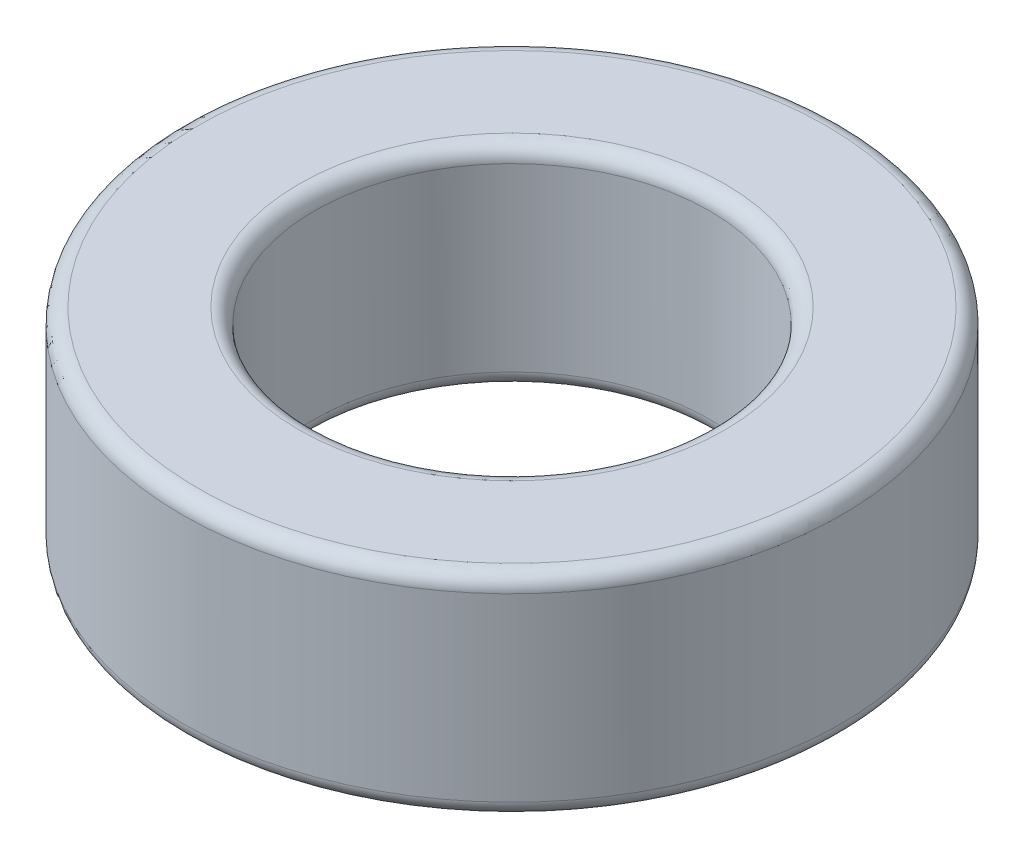
ISO-10303-21;
HEADER;
FILE_DESCRIPTION(('STEP AP214'),'2;1');
FILE_NAME('part.step','',(''),(''),'','','');
FILE_SCHEMA(('AUTOMOTIVE_DESIGN { 1 0 10303 214 1 1 1 1 }'));
ENDSEC;
DATA;
#1=APPLICATION_CONTEXT('core data for automotive mechanical design processes');
#2=APPLICATION_PROTOCOL_DEFINITION('international standard','automotive_design',2000,#1);
#3=PRODUCT_CONTEXT('',#1,'mechanical');
#4=PRODUCT('Part','Part','',(#3));
#5=PRODUCT_RELATED_PRODUCT_CATEGORY('part','',(#4));
#6=PRODUCT_DEFINITION_FORMATION('','',#4);
#7=PRODUCT_DEFINITION_CONTEXT('part definition',#1,'design');
#8=PRODUCT_DEFINITION('design','',#6,#7);
#9=PRODUCT_DEFINITION_SHAPE('','',#8);
#10=(LENGTH_UNIT() NAMED_UNIT(*) SI_UNIT(.MILLI.,.METRE.));
#11=(NAMED_UNIT(*) PLANE_ANGLE_UNIT() SI_UNIT($,.RADIAN.));
#12=(NAMED_UNIT(*) SI_UNIT($,.STERADIAN.) SOLID_ANGLE_UNIT());
#13=UNCERTAINTY_MEASURE_WITH_UNIT(LENGTH_MEASURE(1.E-05),#10,'distance_accuracy_value','');
#14=(GEOMETRIC_REPRESENTATION_CONTEXT(3) GLOBAL_UNCERTAINTY_ASSIGNED_CONTEXT((#13)) GLOBAL_UNIT_ASSIGNED_CONTEXT((#10,
#11,#12)) REPRESENTATION_CONTEXT('',''));
#15=CARTESIAN_POINT('',(0.,0.,0.));
#16=DIRECTION('',(0.,0.,1.));
#17=DIRECTION('',(1.,0.,0.));
#18=AXIS2_PLACEMENT_3D('',#15,#16,#17);
#19=CARTESIAN_POINT('',(0.,15.8865814696486,0.));
#20=DIRECTION('',(0.,1.,0.));
#21=DIRECTION('',(0.,0.,1.));
#22=AXIS2_PLACEMENT_3D('',#19,#20,#21);
#23=CYLINDRICAL_SURFACE('',#22,21.275);
#24=CARTESIAN_POINT('',(0.,-5.825,0.));
#25=DIRECTION('',(0.,1.,0.));
#26=DIRECTION('',(0.,0.,1.));
#27=AXIS2_PLACEMENT_3D('',#24,#25,#26);
#28=CIRCLE('',#27,21.275);
#29=CARTESIAN_POINT('',(0.,-5.825,21.275));
#30=VERTEX_POINT('',#29);
#31=EDGE_CURVE('E50',#30,#30,#28,.T.);
#32=ORIENTED_EDGE('',*,*,#31,.T.);
#33=EDGE_LOOP('',(#32));
#34=FACE_BOUND('',#33,.T.);
#35=CARTESIAN_POINT('',(0.,5.825,0.));
#36=DIRECTION('',(0.,-1.,0.));
#37=DIRECTION('',(0.,0.,-1.));
#38=AXIS2_PLACEMENT_3D('',#35,#36,#37);
#39=CIRCLE('',#38,21.275);
#40=CARTESIAN_POINT('',(0.,5.825,-21.275));
#41=VERTEX_POINT('',#40);
#42=EDGE_CURVE('E55',#41,#41,#39,.T.);
#43=ORIENTED_EDGE('',*,*,#42,.T.);
#44=EDGE_LOOP('',(#43));
#45=FACE_BOUND('',#44,.T.);
#46=ADVANCED_FACE('F37',(#34,#45),#23,.T.);
#47=CARTESIAN_POINT('',(12.75,6.825,0.));
#48=DIRECTION('',(0.,-1.,0.));
#49=DIRECTION('',(0.,0.,-1.));
#50=AXIS2_PLACEMENT_3D('',#47,#48,#49);
#51=PLANE('',#50);
#52=CARTESIAN_POINT('',(0.,6.825,0.));
#53=DIRECTION('',(0.,-1.,0.));
#54=DIRECTION('',(0.,0.,-1.));
#55=AXIS2_PLACEMENT_3D('',#52,#53,#54);
#56=CIRCLE('',#55,20.275);
#57=CARTESIAN_POINT('',(0.,6.825,-20.275));
#58=VERTEX_POINT('',#57);
#59=EDGE_CURVE('E10',#58,#58,#56,.F.);
#60=ORIENTED_EDGE('',*,*,#59,.T.);
#61=EDGE_LOOP('',(#60));
#62=FACE_BOUND('',#61,.T.);
#63=CARTESIAN_POINT('',(0.,6.825,0.));
#64=DIRECTION('',(0.,-1.,0.));
#65=DIRECTION('',(0.,0.,-1.));
#66=AXIS2_PLACEMENT_3D('',#63,#64,#65);
#67=CIRCLE('',#66,13.75);
#68=CARTESIAN_POINT('',(0.,6.825,-13.75));
#69=VERTEX_POINT('',#68);
#70=EDGE_CURVE('E45',#69,#69,#67,.T.);
#71=ORIENTED_EDGE('',*,*,#70,.T.);
#72=EDGE_LOOP('',(#71));
#73=FACE_BOUND('',#72,.T.);
#74=ADVANCED_FACE('F90',(#62,#73),#51,.F.);
#75=CARTESIAN_POINT('',(0.,15.8865814696486,0.));
#76=DIRECTION('',(0.,1.,0.));
#77=DIRECTION('',(0.,0.,1.));
#78=AXIS2_PLACEMENT_3D('',#75,#76,#77);
#79=CYLINDRICAL_SURFACE('',#78,12.75);
#80=CARTESIAN_POINT('',(0.,-5.825,0.));
#81=DIRECTION('',(0.,1.,0.));
#82=DIRECTION('',(0.,0.,1.));
#83=AXIS2_PLACEMENT_3D('',#80,#81,#82);
#84=CIRCLE('',#83,12.75);
#85=CARTESIAN_POINT('',(0.,-5.825,12.75));
#86=VERTEX_POINT('',#85);
#87=EDGE_CURVE('E61',#86,#86,#84,.F.);
#88=ORIENTED_EDGE('',*,*,#87,.T.);
#89=EDGE_LOOP('',(#88));
#90=FACE_BOUND('',#89,.T.);
#91=CARTESIAN_POINT('',(0.,5.825,0.));
#92=DIRECTION('',(0.,-1.,0.));
#93=DIRECTION('',(0.,0.,-1.));
#94=AXIS2_PLACEMENT_3D('',#91,#92,#93);
#95=CIRCLE('',#94,12.75);
#96=CARTESIAN_POINT('',(0.,5.825,-12.75));
#97=VERTEX_POINT('',#96);
#98=EDGE_CURVE('E65',#97,#97,#95,.F.);
#99=ORIENTED_EDGE('',*,*,#98,.T.);
#100=EDGE_LOOP('',(#99));
#101=FACE_BOUND('',#100,.T.);
#102=ADVANCED_FACE('F106',(#90,#101),#79,.F.);
#103=CARTESIAN_POINT('',(12.75,-6.825,0.));
#104=DIRECTION('',(0.,1.,0.));
#105=DIRECTION('',(0.,0.,1.));
#106=AXIS2_PLACEMENT_3D('',#103,#104,#105);
#107=PLANE('',#106);
#108=CARTESIAN_POINT('',(0.,-6.825,0.));
#109=DIRECTION('',(0.,1.,0.));
#110=DIRECTION('',(0.,0.,1.));
#111=AXIS2_PLACEMENT_3D('',#108,#109,#110);
#112=CIRCLE('',#111,13.75);
#113=CARTESIAN_POINT('',(0.,-6.825,13.75));
#114=VERTEX_POINT('',#113);
#115=EDGE_CURVE('E69',#114,#114,#112,.T.);
#116=ORIENTED_EDGE('',*,*,#115,.T.);
#117=EDGE_LOOP('',(#116));
#118=FACE_BOUND('',#117,.T.);
#119=CARTESIAN_POINT('',(0.,-6.825,0.));
#120=DIRECTION('',(0.,1.,0.));
#121=DIRECTION('',(0.,0.,1.));
#122=AXIS2_PLACEMENT_3D('',#119,#120,#121);
#123=CIRCLE('',#122,20.275);
#124=CARTESIAN_POINT('',(0.,-6.825,20.275));
#125=VERTEX_POINT('',#124);
#126=EDGE_CURVE('E73',#125,#125,#123,.F.);
#127=ORIENTED_EDGE('',*,*,#126,.T.);
#128=EDGE_LOOP('',(#127));
#129=FACE_BOUND('',#128,.T.);
#130=ADVANCED_FACE('F78',(#118,#129),#107,.F.);
#131=CARTESIAN_POINT('',(0.,-5.825,0.));
#132=DIRECTION('',(0.,1.,0.));
#133=DIRECTION('',(0.,0.,1.));
#134=AXIS2_PLACEMENT_3D('',#131,#132,#133);
#135=TOROIDAL_SURFACE('',#134,13.75,1.);
#136=ORIENTED_EDGE('',*,*,#87,.F.);
#137=EDGE_LOOP('',(#136));
#138=FACE_BOUND('',#137,.T.);
#139=ORIENTED_EDGE('',*,*,#115,.F.);
#140=EDGE_LOOP('',(#139));
#141=FACE_BOUND('',#140,.T.);
#142=ADVANCED_FACE('F84',(#138,#141),#135,.T.);
#143=CARTESIAN_POINT('',(0.,-5.825,0.));
#144=DIRECTION('',(0.,1.,0.));
#145=DIRECTION('',(0.,0.,1.));
#146=AXIS2_PLACEMENT_3D('',#143,#144,#145);
#147=TOROIDAL_SURFACE('',#146,20.275,1.);
#148=ORIENTED_EDGE('',*,*,#126,.F.);
#149=EDGE_LOOP('',(#148));
#150=FACE_BOUND('',#149,.T.);
#151=ORIENTED_EDGE('',*,*,#31,.F.);
#152=EDGE_LOOP('',(#151));
#153=FACE_BOUND('',#152,.T.);
#154=ADVANCED_FACE('F80',(#150,#153),#147,.T.);
#155=CARTESIAN_POINT('',(0.,5.825,0.));
#156=DIRECTION('',(0.,-1.,0.));
#157=DIRECTION('',(0.,0.,-1.));
#158=AXIS2_PLACEMENT_3D('',#155,#156,#157);
#159=TOROIDAL_SURFACE('',#158,20.275,1.);
#160=ORIENTED_EDGE('',*,*,#42,.F.);
#161=EDGE_LOOP('',(#160));
#162=FACE_BOUND('',#161,.T.);
#163=ORIENTED_EDGE('',*,*,#59,.F.);
#164=EDGE_LOOP('',(#163));
#165=FACE_BOUND('',#164,.T.);
#166=ADVANCED_FACE('F83',(#162,#165),#159,.T.);
#167=CARTESIAN_POINT('',(0.,5.825,0.));
#168=DIRECTION('',(0.,-1.,0.));
#169=DIRECTION('',(0.,0.,-1.));
#170=AXIS2_PLACEMENT_3D('',#167,#168,#169);
#171=TOROIDAL_SURFACE('',#170,13.75,1.);
#172=ORIENTED_EDGE('',*,*,#70,.F.);
#173=EDGE_LOOP('',(#172));
#174=FACE_BOUND('',#173,.T.);
#175=ORIENTED_EDGE('',*,*,#98,.F.);
#176=EDGE_LOOP('',(#175));
#177=FACE_BOUND('',#176,.T.);
#178=ADVANCED_FACE('F39',(#174,#177),#171,.T.);
#179=CLOSED_SHELL('',(#46,#74,#102,#130,#142,#154,#166,#178));
#180=MANIFOLD_SOLID_BREP('B2',#179);
#181=ADVANCED_BREP_SHAPE_REPRESENTATION('',(#18,#180),#14);
#182=SHAPE_DEFINITION_REPRESENTATION(#9,#181);
ENDSEC;
END-ISO-10303-21;
